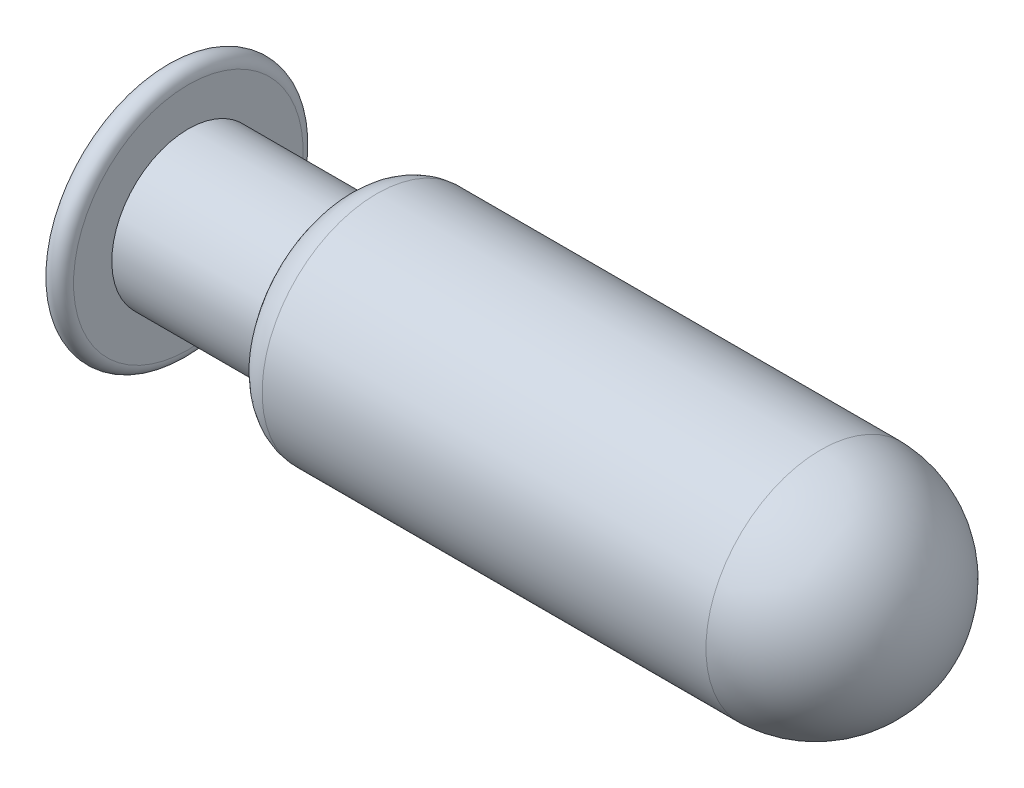
ISO-10303-21;
HEADER;
FILE_DESCRIPTION(('STEP AP214'),'2;1');
FILE_NAME('part.step','',(''),(''),'','','');
FILE_SCHEMA(('AUTOMOTIVE_DESIGN { 1 0 10303 214 1 1 1 1 }'));
ENDSEC;
DATA;
#1=APPLICATION_CONTEXT('core data for automotive mechanical design processes');
#2=APPLICATION_PROTOCOL_DEFINITION('international standard','automotive_design',2000,#1);
#3=PRODUCT_CONTEXT('',#1,'mechanical');
#4=PRODUCT('Part','Part','',(#3));
#5=PRODUCT_RELATED_PRODUCT_CATEGORY('part','',(#4));
#6=PRODUCT_DEFINITION_FORMATION('','',#4);
#7=PRODUCT_DEFINITION_CONTEXT('part definition',#1,'design');
#8=PRODUCT_DEFINITION('design','',#6,#7);
#9=PRODUCT_DEFINITION_SHAPE('','',#8);
#10=(LENGTH_UNIT() NAMED_UNIT(*) SI_UNIT(.MILLI.,.METRE.));
#11=(NAMED_UNIT(*) PLANE_ANGLE_UNIT() SI_UNIT($,.RADIAN.));
#12=(NAMED_UNIT(*) SI_UNIT($,.STERADIAN.) SOLID_ANGLE_UNIT());
#13=UNCERTAINTY_MEASURE_WITH_UNIT(LENGTH_MEASURE(1.E-05),#10,'distance_accuracy_value','');
#14=(GEOMETRIC_REPRESENTATION_CONTEXT(3) GLOBAL_UNCERTAINTY_ASSIGNED_CONTEXT((#13)) GLOBAL_UNIT_ASSIGNED_CONTEXT((#10,
#11,#12)) REPRESENTATION_CONTEXT('',''));
#15=CARTESIAN_POINT('',(0.,0.,0.));
#16=DIRECTION('',(0.,0.,1.));
#17=DIRECTION('',(1.,0.,0.));
#18=AXIS2_PLACEMENT_3D('',#15,#16,#17);
#19=CARTESIAN_POINT('',(3.,0.,0.));
#20=DIRECTION('',(-1.,0.,0.));
#21=DIRECTION('',(0.,-1.,0.));
#22=AXIS2_PLACEMENT_3D('',#19,#20,#21);
#23=PLANE('',#22);
#24=CARTESIAN_POINT('',(3.,0.,0.));
#25=DIRECTION('',(1.,0.,0.));
#26=DIRECTION('',(0.,1.,0.));
#27=AXIS2_PLACEMENT_3D('',#24,#25,#26);
#28=CIRCLE('',#27,9.99999999999999);
#29=CARTESIAN_POINT('',(3.,9.99999999999999,0.));
#30=VERTEX_POINT('',#29);
#31=EDGE_CURVE('E54',#30,#30,#28,.T.);
#32=ORIENTED_EDGE('',*,*,#31,.F.);
#33=EDGE_LOOP('',(#32));
#34=FACE_BOUND('',#33,.T.);
#35=CARTESIAN_POINT('',(2.99999999999999,0.,0.));
#36=DIRECTION('',(1.,0.,0.));
#37=DIRECTION('',(0.,1.,0.));
#38=AXIS2_PLACEMENT_3D('',#35,#36,#37);
#39=CIRCLE('',#38,15.);
#40=CARTESIAN_POINT('',(2.99999999999999,15.,0.));
#41=VERTEX_POINT('',#40);
#42=EDGE_CURVE('E57',#41,#41,#39,.T.);
#43=ORIENTED_EDGE('',*,*,#42,.T.);
#44=EDGE_LOOP('',(#43));
#45=FACE_BOUND('',#44,.T.);
#46=ADVANCED_FACE('F34',(#34,#45),#23,.F.);
#47=CARTESIAN_POINT('',(100.,0.,0.));
#48=DIRECTION('',(1.,0.,0.));
#49=DIRECTION('',(0.,1.,0.));
#50=AXIS2_PLACEMENT_3D('',#47,#48,#49);
#51=CYLINDRICAL_SURFACE('',#50,9.99999999999999);
#52=CARTESIAN_POINT('',(23.,0.,0.));
#53=DIRECTION('',(1.,0.,0.));
#54=DIRECTION('',(0.,1.,0.));
#55=AXIS2_PLACEMENT_3D('',#52,#53,#54);
#56=CIRCLE('',#55,9.99999999999999);
#57=CARTESIAN_POINT('',(23.,9.99999999999999,0.));
#58=VERTEX_POINT('',#57);
#59=EDGE_CURVE('E49',#58,#58,#56,.T.);
#60=ORIENTED_EDGE('',*,*,#59,.F.);
#61=EDGE_LOOP('',(#60));
#62=FACE_BOUND('',#61,.T.);
#63=ORIENTED_EDGE('',*,*,#31,.T.);
#64=EDGE_LOOP('',(#63));
#65=FACE_BOUND('',#64,.T.);
#66=ADVANCED_FACE('F64',(#62,#65),#51,.T.);
#67=CARTESIAN_POINT('',(28.,0.,0.));
#68=DIRECTION('',(1.,0.,0.));
#69=DIRECTION('',(0.,1.,0.));
#70=AXIS2_PLACEMENT_3D('',#67,#68,#69);
#71=TOROIDAL_SURFACE('',#70,9.99999999999999,5.);
#72=CARTESIAN_POINT('',(27.6343245276821,0.,0.));
#73=DIRECTION('',(1.,0.,0.));
#74=DIRECTION('',(0.,1.,0.));
#75=AXIS2_PLACEMENT_3D('',#72,#73,#74);
#76=CIRCLE('',#75,14.9866102162637);
#77=CARTESIAN_POINT('',(27.6343245276821,14.9866102162637,0.));
#78=VERTEX_POINT('',#77);
#79=EDGE_CURVE('E45',#78,#78,#76,.T.);
#80=ORIENTED_EDGE('',*,*,#79,.F.);
#81=EDGE_LOOP('',(#80));
#82=FACE_BOUND('',#81,.T.);
#83=ORIENTED_EDGE('',*,*,#59,.T.);
#84=EDGE_LOOP('',(#83));
#85=FACE_BOUND('',#84,.T.);
#86=ADVANCED_FACE('F71',(#82,#85),#71,.T.);
#87=CARTESIAN_POINT('',(100.,0.,0.));
#88=DIRECTION('',(1.,0.,0.));
#89=DIRECTION('',(0.,1.,0.));
#90=AXIS2_PLACEMENT_3D('',#87,#88,#89);
#91=CYLINDRICAL_SURFACE('',#90,14.9866102162636);
#92=CARTESIAN_POINT('',(85.6336515018383,0.,0.));
#93=DIRECTION('',(1.,0.,0.));
#94=DIRECTION('',(0.,1.,0.));
#95=AXIS2_PLACEMENT_3D('',#92,#93,#94);
#96=CIRCLE('',#95,14.9866102162637);
#97=CARTESIAN_POINT('',(85.6336515018383,14.9866102162637,0.));
#98=VERTEX_POINT('',#97);
#99=EDGE_CURVE('E41',#98,#98,#96,.T.);
#100=ORIENTED_EDGE('',*,*,#99,.F.);
#101=EDGE_LOOP('',(#100));
#102=FACE_BOUND('',#101,.T.);
#103=ORIENTED_EDGE('',*,*,#79,.T.);
#104=EDGE_LOOP('',(#103));
#105=FACE_BOUND('',#104,.T.);
#106=ADVANCED_FACE('F83',(#102,#105),#91,.T.);
#107=CARTESIAN_POINT('',(85.,0.,0.));
#108=DIRECTION('',(1.,0.,0.));
#109=DIRECTION('',(0.,1.,0.));
#110=AXIS2_PLACEMENT_3D('',#107,#108,#109);
#111=SPHERICAL_SURFACE('',#110,15.);
#112=ORIENTED_EDGE('',*,*,#99,.T.);
#113=EDGE_LOOP('',(#112));
#114=FACE_BOUND('',#113,.T.);
#115=ADVANCED_FACE('F68',(#114),#111,.T.);
#116=CARTESIAN_POINT('',(0.,0.,0.));
#117=DIRECTION('',(1.,0.,0.));
#118=DIRECTION('',(0.,1.,0.));
#119=AXIS2_PLACEMENT_3D('',#116,#117,#118);
#120=PLANE('',#119);
#121=CARTESIAN_POINT('',(0.,0.,0.));
#122=DIRECTION('',(1.,0.,0.));
#123=DIRECTION('',(0.,1.,0.));
#124=AXIS2_PLACEMENT_3D('',#121,#122,#123);
#125=CIRCLE('',#124,15.);
#126=CARTESIAN_POINT('',(0.,15.,0.));
#127=VERTEX_POINT('',#126);
#128=EDGE_CURVE('E10',#127,#127,#125,.T.);
#129=ORIENTED_EDGE('',*,*,#128,.F.);
#130=EDGE_LOOP('',(#129));
#131=FACE_BOUND('',#130,.T.);
#132=ADVANCED_FACE('F63',(#131),#120,.F.);
#133=CARTESIAN_POINT('',(1.5,0.,0.));
#134=DIRECTION('',(1.,0.,0.));
#135=DIRECTION('',(0.,1.,0.));
#136=AXIS2_PLACEMENT_3D('',#133,#134,#135);
#137=TOROIDAL_SURFACE('',#136,15.,1.5);
#138=ORIENTED_EDGE('',*,*,#128,.T.);
#139=EDGE_LOOP('',(#138));
#140=FACE_BOUND('',#139,.T.);
#141=ORIENTED_EDGE('',*,*,#42,.F.);
#142=EDGE_LOOP('',(#141));
#143=FACE_BOUND('',#142,.T.);
#144=ADVANCED_FACE('F36',(#140,#143),#137,.T.);
#145=CLOSED_SHELL('',(#46,#66,#86,#106,#115,#132,#144));
#146=MANIFOLD_SOLID_BREP('B2',#145);
#147=ADVANCED_BREP_SHAPE_REPRESENTATION('',(#18,#146),#14);
#148=SHAPE_DEFINITION_REPRESENTATION(#9,#147);
ENDSEC;
END-ISO-10303-21;
